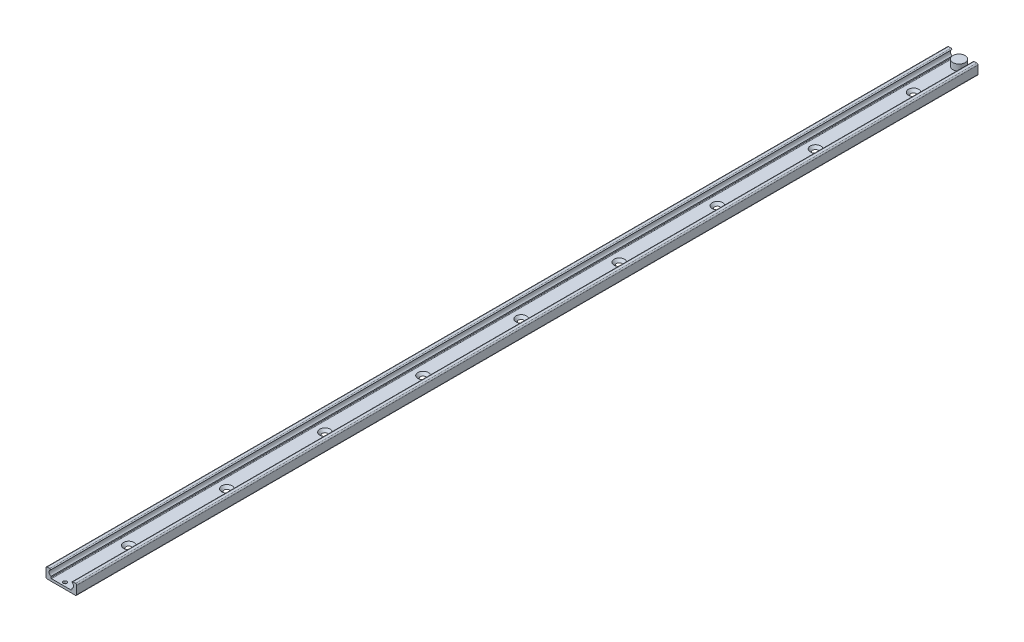
ISO-10303-21;
HEADER;
FILE_DESCRIPTION(('STEP AP214'),'2;1');
FILE_NAME('part.step','',(''),(''),'','','');
FILE_SCHEMA(('AUTOMOTIVE_DESIGN { 1 0 10303 214 1 1 1 1 }'));
ENDSEC;
DATA;
#1=APPLICATION_CONTEXT('core data for automotive mechanical design processes');
#2=APPLICATION_PROTOCOL_DEFINITION('international standard','automotive_design',2000,#1);
#3=PRODUCT_CONTEXT('',#1,'mechanical');
#4=PRODUCT('Part','Part','',(#3));
#5=PRODUCT_RELATED_PRODUCT_CATEGORY('part','',(#4));
#6=PRODUCT_DEFINITION_FORMATION('','',#4);
#7=PRODUCT_DEFINITION_CONTEXT('part definition',#1,'design');
#8=PRODUCT_DEFINITION('design','',#6,#7);
#9=PRODUCT_DEFINITION_SHAPE('','',#8);
#10=(LENGTH_UNIT() NAMED_UNIT(*) SI_UNIT(.MILLI.,.METRE.));
#11=(NAMED_UNIT(*) PLANE_ANGLE_UNIT() SI_UNIT($,.RADIAN.));
#12=(NAMED_UNIT(*) SI_UNIT($,.STERADIAN.) SOLID_ANGLE_UNIT());
#13=UNCERTAINTY_MEASURE_WITH_UNIT(LENGTH_MEASURE(1.E-05),#10,'distance_accuracy_value','');
#14=(GEOMETRIC_REPRESENTATION_CONTEXT(3) GLOBAL_UNCERTAINTY_ASSIGNED_CONTEXT((#13)) GLOBAL_UNIT_ASSIGNED_CONTEXT((#10,
#11,#12)) REPRESENTATION_CONTEXT('',''));
#15=CARTESIAN_POINT('',(0.,0.,0.));
#16=DIRECTION('',(0.,0.,1.));
#17=DIRECTION('',(1.,0.,0.));
#18=AXIS2_PLACEMENT_3D('',#15,#16,#17);
#19=CARTESIAN_POINT('',(9.5,7.5,0.));
#20=DIRECTION('',(0.,0.,1.));
#21=DIRECTION('',(1.,0.,0.));
#22=AXIS2_PLACEMENT_3D('',#19,#20,#21);
#23=CYLINDRICAL_SURFACE('',#22,1.);
#24=DIRECTION('',(0.,0.,1.));
#25=VECTOR('',#24,1.);
#26=CARTESIAN_POINT('',(8.60359240331616,7.94323066298205,0.));
#27=LINE('',#26,#25);
#28=CARTESIAN_POINT('',(8.60359240331616,7.94323066298205,0.));
#29=VERTEX_POINT('',#28);
#30=CARTESIAN_POINT('',(8.60359240331616,7.94323066298205,735.));
#31=VERTEX_POINT('',#30);
#32=EDGE_CURVE('E398',#29,#31,#27,.T.);
#33=ORIENTED_EDGE('',*,*,#32,.T.);
#34=CARTESIAN_POINT('',(9.5,7.5,735.));
#35=DIRECTION('',(0.,0.,1.));
#36=DIRECTION('',(1.,0.,0.));
#37=AXIS2_PLACEMENT_3D('',#34,#35,#36);
#38=CIRCLE('',#37,1.);
#39=CARTESIAN_POINT('',(9.5,8.5,735.));
#40=VERTEX_POINT('',#39);
#41=EDGE_CURVE('E228',#40,#31,#38,.T.);
#42=ORIENTED_EDGE('',*,*,#41,.F.);
#43=DIRECTION('',(0.,0.,1.));
#44=VECTOR('',#43,1.);
#45=CARTESIAN_POINT('',(9.5,8.5,0.));
#46=LINE('',#45,#44);
#47=CARTESIAN_POINT('',(9.5,8.5,0.));
#48=VERTEX_POINT('',#47);
#49=EDGE_CURVE('E399',#48,#40,#46,.T.);
#50=ORIENTED_EDGE('',*,*,#49,.F.);
#51=CARTESIAN_POINT('',(9.5,7.5,0.));
#52=DIRECTION('',(0.,0.,1.));
#53=DIRECTION('',(1.,0.,0.));
#54=AXIS2_PLACEMENT_3D('',#51,#52,#53);
#55=CIRCLE('',#54,1.);
#56=EDGE_CURVE('E350',#48,#29,#55,.T.);
#57=ORIENTED_EDGE('',*,*,#56,.T.);
#58=EDGE_LOOP('',(#33,#42,#50,#57));
#59=FACE_BOUND('',#58,.T.);
#60=ADVANCED_FACE('F45',(#59),#23,.T.);
#61=CARTESIAN_POINT('',(12.5,8.5,0.));
#62=DIRECTION('',(0.,1.,0.));
#63=DIRECTION('',(0.,0.,1.));
#64=AXIS2_PLACEMENT_3D('',#61,#62,#63);
#65=PLANE('',#64);
#66=ORIENTED_EDGE('',*,*,#49,.T.);
#67=DIRECTION('',(-1.,0.,0.));
#68=VECTOR('',#67,1.);
#69=CARTESIAN_POINT('',(0.,8.5,735.));
#70=LINE('',#69,#68);
#71=CARTESIAN_POINT('',(11.5000000000008,8.5,735.));
#72=VERTEX_POINT('',#71);
#73=EDGE_CURVE('E224',#72,#40,#70,.T.);
#74=ORIENTED_EDGE('',*,*,#73,.F.);
#75=DIRECTION('',(0.,0.,1.));
#76=VECTOR('',#75,1.);
#77=CARTESIAN_POINT('',(11.5000000000008,8.5,0.));
#78=LINE('',#77,#76);
#79=CARTESIAN_POINT('',(11.5000000000008,8.5,0.));
#80=VERTEX_POINT('',#79);
#81=EDGE_CURVE('E451',#72,#80,#78,.F.);
#82=ORIENTED_EDGE('',*,*,#81,.T.);
#83=DIRECTION('',(-1.,0.,0.));
#84=VECTOR('',#83,1.);
#85=CARTESIAN_POINT('',(12.5,8.5,0.));
#86=LINE('',#85,#84);
#87=EDGE_CURVE('E395',#80,#48,#86,.T.);
#88=ORIENTED_EDGE('',*,*,#87,.T.);
#89=EDGE_LOOP('',(#66,#74,#82,#88));
#90=FACE_BOUND('',#89,.T.);
#91=ADVANCED_FACE('F632',(#90),#65,.T.);
#92=CARTESIAN_POINT('',(12.5,0.,0.));
#93=DIRECTION('',(1.,0.,0.));
#94=DIRECTION('',(0.,0.,-1.));
#95=AXIS2_PLACEMENT_3D('',#92,#93,#94);
#96=PLANE('',#95);
#97=DIRECTION('',(0.,0.,1.));
#98=VECTOR('',#97,1.);
#99=CARTESIAN_POINT('',(12.5,7.50000000000078,0.));
#100=LINE('',#99,#98);
#101=CARTESIAN_POINT('',(12.5,7.50000000000078,0.));
#102=VERTEX_POINT('',#101);
#103=CARTESIAN_POINT('',(12.5,7.50000000000078,735.));
#104=VERTEX_POINT('',#103);
#105=EDGE_CURVE('E435',#102,#104,#100,.T.);
#106=ORIENTED_EDGE('',*,*,#105,.T.);
#107=DIRECTION('',(0.,1.,0.));
#108=VECTOR('',#107,1.);
#109=CARTESIAN_POINT('',(12.5,0.,735.));
#110=LINE('',#109,#108);
#111=CARTESIAN_POINT('',(12.5,0.999999999999222,735.));
#112=VERTEX_POINT('',#111);
#113=EDGE_CURVE('E216',#112,#104,#110,.T.);
#114=ORIENTED_EDGE('',*,*,#113,.F.);
#115=DIRECTION('',(0.,0.,1.));
#116=VECTOR('',#115,1.);
#117=CARTESIAN_POINT('',(12.5,0.999999999999222,0.));
#118=LINE('',#117,#116);
#119=CARTESIAN_POINT('',(12.5,0.999999999999222,0.));
#120=VERTEX_POINT('',#119);
#121=EDGE_CURVE('E438',#112,#120,#118,.F.);
#122=ORIENTED_EDGE('',*,*,#121,.T.);
#123=DIRECTION('',(0.,1.,0.));
#124=VECTOR('',#123,1.);
#125=CARTESIAN_POINT('',(12.5,0.,0.));
#126=LINE('',#125,#124);
#127=EDGE_CURVE('E391',#120,#102,#126,.T.);
#128=ORIENTED_EDGE('',*,*,#127,.T.);
#129=EDGE_LOOP('',(#106,#114,#122,#128));
#130=FACE_BOUND('',#129,.T.);
#131=ADVANCED_FACE('F638',(#130),#96,.T.);
#132=CARTESIAN_POINT('',(-12.5,0.,0.));
#133=DIRECTION('',(0.,-1.,0.));
#134=DIRECTION('',(0.,0.,-1.));
#135=AXIS2_PLACEMENT_3D('',#132,#133,#134);
#136=PLANE('',#135);
#137=CARTESIAN_POINT('',(0.,0.,732.));
#138=DIRECTION('',(0.,1.,0.));
#139=DIRECTION('',(0.,0.,1.));
#140=AXIS2_PLACEMENT_3D('',#137,#138,#139);
#141=CIRCLE('',#140,1.5);
#142=CARTESIAN_POINT('',(0.,0.,733.5));
#143=VERTEX_POINT('',#142);
#144=EDGE_CURVE('E204',#143,#143,#141,.T.);
#145=ORIENTED_EDGE('',*,*,#144,.T.);
#146=EDGE_LOOP('',(#145));
#147=FACE_BOUND('',#146,.T.);
#148=CARTESIAN_POINT('',(0.,0.,40.));
#149=DIRECTION('',(0.,1.,0.));
#150=DIRECTION('',(0.,0.,1.));
#151=AXIS2_PLACEMENT_3D('',#148,#149,#150);
#152=CIRCLE('',#151,2.25000000000002);
#153=CARTESIAN_POINT('',(0.,0.,42.25));
#154=VERTEX_POINT('',#153);
#155=EDGE_CURVE('E277',#154,#154,#152,.T.);
#156=ORIENTED_EDGE('',*,*,#155,.T.);
#157=EDGE_LOOP('',(#156));
#158=FACE_BOUND('',#157,.T.);
#159=CARTESIAN_POINT('',(0.,0.,680.));
#160=DIRECTION('',(0.,1.,0.));
#161=DIRECTION('',(0.,0.,1.));
#162=AXIS2_PLACEMENT_3D('',#159,#160,#161);
#163=CIRCLE('',#162,2.25000000000002);
#164=CARTESIAN_POINT('',(0.,0.,682.25));
#165=VERTEX_POINT('',#164);
#166=EDGE_CURVE('E285',#165,#165,#163,.T.);
#167=ORIENTED_EDGE('',*,*,#166,.T.);
#168=EDGE_LOOP('',(#167));
#169=FACE_BOUND('',#168,.T.);
#170=CARTESIAN_POINT('',(0.,0.,600.));
#171=DIRECTION('',(0.,1.,0.));
#172=DIRECTION('',(0.,0.,1.));
#173=AXIS2_PLACEMENT_3D('',#170,#171,#172);
#174=CIRCLE('',#173,2.25000000000002);
#175=CARTESIAN_POINT('',(0.,0.,602.25));
#176=VERTEX_POINT('',#175);
#177=EDGE_CURVE('E293',#176,#176,#174,.T.);
#178=ORIENTED_EDGE('',*,*,#177,.T.);
#179=EDGE_LOOP('',(#178));
#180=FACE_BOUND('',#179,.T.);
#181=CARTESIAN_POINT('',(0.,0.,520.));
#182=DIRECTION('',(0.,1.,0.));
#183=DIRECTION('',(0.,0.,1.));
#184=AXIS2_PLACEMENT_3D('',#181,#182,#183);
#185=CIRCLE('',#184,2.25000000000002);
#186=CARTESIAN_POINT('',(0.,0.,522.25));
#187=VERTEX_POINT('',#186);
#188=EDGE_CURVE('E301',#187,#187,#185,.T.);
#189=ORIENTED_EDGE('',*,*,#188,.T.);
#190=EDGE_LOOP('',(#189));
#191=FACE_BOUND('',#190,.T.);
#192=CARTESIAN_POINT('',(0.,0.,440.));
#193=DIRECTION('',(0.,1.,0.));
#194=DIRECTION('',(0.,0.,1.));
#195=AXIS2_PLACEMENT_3D('',#192,#193,#194);
#196=CIRCLE('',#195,2.25000000000002);
#197=CARTESIAN_POINT('',(0.,0.,442.25));
#198=VERTEX_POINT('',#197);
#199=EDGE_CURVE('E309',#198,#198,#196,.T.);
#200=ORIENTED_EDGE('',*,*,#199,.T.);
#201=EDGE_LOOP('',(#200));
#202=FACE_BOUND('',#201,.T.);
#203=CARTESIAN_POINT('',(0.,0.,360.));
#204=DIRECTION('',(0.,1.,0.));
#205=DIRECTION('',(0.,0.,1.));
#206=AXIS2_PLACEMENT_3D('',#203,#204,#205);
#207=CIRCLE('',#206,2.25000000000002);
#208=CARTESIAN_POINT('',(0.,0.,362.25));
#209=VERTEX_POINT('',#208);
#210=EDGE_CURVE('E317',#209,#209,#207,.T.);
#211=ORIENTED_EDGE('',*,*,#210,.T.);
#212=EDGE_LOOP('',(#211));
#213=FACE_BOUND('',#212,.T.);
#214=CARTESIAN_POINT('',(0.,0.,280.));
#215=DIRECTION('',(0.,1.,0.));
#216=DIRECTION('',(0.,0.,1.));
#217=AXIS2_PLACEMENT_3D('',#214,#215,#216);
#218=CIRCLE('',#217,2.25000000000002);
#219=CARTESIAN_POINT('',(0.,0.,282.25));
#220=VERTEX_POINT('',#219);
#221=EDGE_CURVE('E325',#220,#220,#218,.T.);
#222=ORIENTED_EDGE('',*,*,#221,.T.);
#223=EDGE_LOOP('',(#222));
#224=FACE_BOUND('',#223,.T.);
#225=CARTESIAN_POINT('',(0.,0.,200.));
#226=DIRECTION('',(0.,1.,0.));
#227=DIRECTION('',(0.,0.,1.));
#228=AXIS2_PLACEMENT_3D('',#225,#226,#227);
#229=CIRCLE('',#228,2.25000000000002);
#230=CARTESIAN_POINT('',(0.,0.,202.25));
#231=VERTEX_POINT('',#230);
#232=EDGE_CURVE('E333',#231,#231,#229,.T.);
#233=ORIENTED_EDGE('',*,*,#232,.T.);
#234=EDGE_LOOP('',(#233));
#235=FACE_BOUND('',#234,.T.);
#236=CARTESIAN_POINT('',(0.,0.,120.));
#237=DIRECTION('',(0.,1.,0.));
#238=DIRECTION('',(0.,0.,1.));
#239=AXIS2_PLACEMENT_3D('',#236,#237,#238);
#240=CIRCLE('',#239,2.25000000000002);
#241=CARTESIAN_POINT('',(0.,0.,122.25));
#242=VERTEX_POINT('',#241);
#243=EDGE_CURVE('E341',#242,#242,#240,.T.);
#244=ORIENTED_EDGE('',*,*,#243,.T.);
#245=EDGE_LOOP('',(#244));
#246=FACE_BOUND('',#245,.T.);
#247=DIRECTION('',(1.,0.,0.));
#248=VECTOR('',#247,1.);
#249=CARTESIAN_POINT('',(-12.5,0.,0.));
#250=LINE('',#249,#248);
#251=CARTESIAN_POINT('',(-11.5000000000008,0.,0.));
#252=VERTEX_POINT('',#251);
#253=CARTESIAN_POINT('',(11.5000000000008,0.,0.));
#254=VERTEX_POINT('',#253);
#255=EDGE_CURVE('E388',#252,#254,#250,.T.);
#256=ORIENTED_EDGE('',*,*,#255,.T.);
#257=DIRECTION('',(0.,0.,1.));
#258=VECTOR('',#257,1.);
#259=CARTESIAN_POINT('',(11.5000000000008,0.,0.));
#260=LINE('',#259,#258);
#261=CARTESIAN_POINT('',(11.5000000000008,0.,735.));
#262=VERTEX_POINT('',#261);
#263=EDGE_CURVE('E185',#254,#262,#260,.T.);
#264=ORIENTED_EDGE('',*,*,#263,.T.);
#265=DIRECTION('',(1.,0.,0.));
#266=VECTOR('',#265,1.);
#267=CARTESIAN_POINT('',(0.,0.,735.));
#268=LINE('',#267,#266);
#269=CARTESIAN_POINT('',(-11.5000000000008,0.,735.));
#270=VERTEX_POINT('',#269);
#271=EDGE_CURVE('E189',#270,#262,#268,.T.);
#272=ORIENTED_EDGE('',*,*,#271,.F.);
#273=DIRECTION('',(0.,0.,1.));
#274=VECTOR('',#273,1.);
#275=CARTESIAN_POINT('',(-11.5000000000008,0.,0.));
#276=LINE('',#275,#274);
#277=EDGE_CURVE('E177',#270,#252,#276,.F.);
#278=ORIENTED_EDGE('',*,*,#277,.T.);
#279=EDGE_LOOP('',(#256,#264,#272,#278));
#280=FACE_BOUND('',#279,.T.);
#281=ADVANCED_FACE('F190',(#147,#158,#169,#180,#191,#202,#213,#224,#235,#246,#280),#136,.T.);
#282=CARTESIAN_POINT('',(-12.5,8.5,0.));
#283=DIRECTION('',(-1.,0.,0.));
#284=DIRECTION('',(0.,0.,1.));
#285=AXIS2_PLACEMENT_3D('',#282,#283,#284);
#286=PLANE('',#285);
#287=DIRECTION('',(0.,0.,1.));
#288=VECTOR('',#287,1.);
#289=CARTESIAN_POINT('',(-12.5,0.999999999999222,0.));
#290=LINE('',#289,#288);
#291=CARTESIAN_POINT('',(-12.5,0.999999999999222,0.));
#292=VERTEX_POINT('',#291);
#293=CARTESIAN_POINT('',(-12.5,0.999999999999222,735.));
#294=VERTEX_POINT('',#293);
#295=EDGE_CURVE('E54',#292,#294,#290,.T.);
#296=ORIENTED_EDGE('',*,*,#295,.T.);
#297=DIRECTION('',(0.,-1.,0.));
#298=VECTOR('',#297,1.);
#299=CARTESIAN_POINT('',(-12.5,0.,735.));
#300=LINE('',#299,#298);
#301=CARTESIAN_POINT('',(-12.5,7.50000000000078,735.));
#302=VERTEX_POINT('',#301);
#303=EDGE_CURVE('E202',#302,#294,#300,.T.);
#304=ORIENTED_EDGE('',*,*,#303,.F.);
#305=DIRECTION('',(0.,0.,1.));
#306=VECTOR('',#305,1.);
#307=CARTESIAN_POINT('',(-12.5,7.50000000000078,0.));
#308=LINE('',#307,#306);
#309=CARTESIAN_POINT('',(-12.5,7.50000000000078,0.));
#310=VERTEX_POINT('',#309);
#311=EDGE_CURVE('E11',#302,#310,#308,.F.);
#312=ORIENTED_EDGE('',*,*,#311,.T.);
#313=DIRECTION('',(0.,-1.,0.));
#314=VECTOR('',#313,1.);
#315=CARTESIAN_POINT('',(-12.5,8.5,0.));
#316=LINE('',#315,#314);
#317=EDGE_CURVE('E385',#310,#292,#316,.T.);
#318=ORIENTED_EDGE('',*,*,#317,.T.);
#319=EDGE_LOOP('',(#296,#304,#312,#318));
#320=FACE_BOUND('',#319,.T.);
#321=ADVANCED_FACE('F460',(#320),#286,.T.);
#322=CARTESIAN_POINT('',(-9.5,8.5,0.));
#323=DIRECTION('',(0.,1.,0.));
#324=DIRECTION('',(0.,0.,1.));
#325=AXIS2_PLACEMENT_3D('',#322,#323,#324);
#326=PLANE('',#325);
#327=DIRECTION('',(-1.,0.,0.));
#328=VECTOR('',#327,1.);
#329=CARTESIAN_POINT('',(-9.5,8.5,0.));
#330=LINE('',#329,#328);
#331=CARTESIAN_POINT('',(-9.5,8.5,0.));
#332=VERTEX_POINT('',#331);
#333=CARTESIAN_POINT('',(-11.5000000000008,8.5,0.));
#334=VERTEX_POINT('',#333);
#335=EDGE_CURVE('E382',#332,#334,#330,.T.);
#336=ORIENTED_EDGE('',*,*,#335,.T.);
#337=DIRECTION('',(0.,0.,1.));
#338=VECTOR('',#337,1.);
#339=CARTESIAN_POINT('',(-11.5000000000008,8.5,0.));
#340=LINE('',#339,#338);
#341=CARTESIAN_POINT('',(-11.5000000000008,8.5,735.));
#342=VERTEX_POINT('',#341);
#343=EDGE_CURVE('E454',#334,#342,#340,.T.);
#344=ORIENTED_EDGE('',*,*,#343,.T.);
#345=DIRECTION('',(-1.,0.,0.));
#346=VECTOR('',#345,1.);
#347=CARTESIAN_POINT('',(0.,8.5,735.));
#348=LINE('',#347,#346);
#349=CARTESIAN_POINT('',(-9.5,8.5,735.));
#350=VERTEX_POINT('',#349);
#351=EDGE_CURVE('E264',#350,#342,#348,.T.);
#352=ORIENTED_EDGE('',*,*,#351,.F.);
#353=DIRECTION('',(0.,0.,1.));
#354=VECTOR('',#353,1.);
#355=CARTESIAN_POINT('',(-9.5,8.5,0.));
#356=LINE('',#355,#354);
#357=EDGE_CURVE('E403',#332,#350,#356,.T.);
#358=ORIENTED_EDGE('',*,*,#357,.F.);
#359=EDGE_LOOP('',(#336,#344,#352,#358));
#360=FACE_BOUND('',#359,.T.);
#361=ADVANCED_FACE('F469',(#360),#326,.T.);
#362=CARTESIAN_POINT('',(-9.5,7.5,0.));
#363=DIRECTION('',(0.,0.,1.));
#364=DIRECTION('',(1.,0.,0.));
#365=AXIS2_PLACEMENT_3D('',#362,#363,#364);
#366=CYLINDRICAL_SURFACE('',#365,1.);
#367=ORIENTED_EDGE('',*,*,#357,.T.);
#368=CARTESIAN_POINT('',(-9.5,7.5,735.));
#369=DIRECTION('',(0.,0.,1.));
#370=DIRECTION('',(1.,0.,0.));
#371=AXIS2_PLACEMENT_3D('',#368,#369,#370);
#372=CIRCLE('',#371,1.);
#373=CARTESIAN_POINT('',(-8.60359240331616,7.94323066298205,735.));
#374=VERTEX_POINT('',#373);
#375=EDGE_CURVE('E260',#374,#350,#372,.T.);
#376=ORIENTED_EDGE('',*,*,#375,.F.);
#377=DIRECTION('',(0.,0.,1.));
#378=VECTOR('',#377,1.);
#379=CARTESIAN_POINT('',(-8.60359240331616,7.94323066298205,0.));
#380=LINE('',#379,#378);
#381=CARTESIAN_POINT('',(-8.60359240331616,7.94323066298205,0.));
#382=VERTEX_POINT('',#381);
#383=EDGE_CURVE('E406',#382,#374,#380,.T.);
#384=ORIENTED_EDGE('',*,*,#383,.F.);
#385=CARTESIAN_POINT('',(-9.5,7.5,0.));
#386=DIRECTION('',(0.,0.,1.));
#387=DIRECTION('',(1.,0.,0.));
#388=AXIS2_PLACEMENT_3D('',#385,#386,#387);
#389=CIRCLE('',#388,1.);
#390=EDGE_CURVE('E378',#382,#332,#389,.T.);
#391=ORIENTED_EDGE('',*,*,#390,.T.);
#392=EDGE_LOOP('',(#367,#376,#384,#391));
#393=FACE_BOUND('',#392,.T.);
#394=ADVANCED_FACE('F473',(#393),#366,.T.);
#395=CARTESIAN_POINT('',(-7.5,5.7,0.));
#396=DIRECTION('',(0.,0.,1.));
#397=DIRECTION('',(1.,0.,0.));
#398=AXIS2_PLACEMENT_3D('',#395,#396,#397);
#399=CYLINDRICAL_SURFACE('',#398,2.5);
#400=ORIENTED_EDGE('',*,*,#383,.T.);
#401=CARTESIAN_POINT('',(-7.5,5.7,735.));
#402=DIRECTION('',(0.,0.,1.));
#403=DIRECTION('',(1.,0.,0.));
#404=AXIS2_PLACEMENT_3D('',#401,#402,#403);
#405=CIRCLE('',#404,2.5);
#406=CARTESIAN_POINT('',(-8.5,3.40871215252208,735.));
#407=VERTEX_POINT('',#406);
#408=EDGE_CURVE('E256',#407,#374,#405,.F.);
#409=ORIENTED_EDGE('',*,*,#408,.F.);
#410=DIRECTION('',(0.,0.,1.));
#411=VECTOR('',#410,1.);
#412=CARTESIAN_POINT('',(-8.5,3.40871215252208,0.));
#413=LINE('',#412,#411);
#414=CARTESIAN_POINT('',(-8.5,3.40871215252208,0.));
#415=VERTEX_POINT('',#414);
#416=EDGE_CURVE('E409',#415,#407,#413,.T.);
#417=ORIENTED_EDGE('',*,*,#416,.F.);
#418=CARTESIAN_POINT('',(-7.5,5.7,0.));
#419=DIRECTION('',(0.,0.,-1.));
#420=DIRECTION('',(-1.,0.,0.));
#421=AXIS2_PLACEMENT_3D('',#418,#419,#420);
#422=CIRCLE('',#421,2.5);
#423=EDGE_CURVE('E374',#415,#382,#422,.T.);
#424=ORIENTED_EDGE('',*,*,#423,.T.);
#425=EDGE_LOOP('',(#400,#409,#417,#424));
#426=FACE_BOUND('',#425,.T.);
#427=ADVANCED_FACE('F479',(#426),#399,.F.);
#428=CARTESIAN_POINT('',(-8.5,2.,0.));
#429=DIRECTION('',(1.,0.,0.));
#430=DIRECTION('',(0.,0.,-1.));
#431=AXIS2_PLACEMENT_3D('',#428,#429,#430);
#432=PLANE('',#431);
#433=ORIENTED_EDGE('',*,*,#416,.T.);
#434=DIRECTION('',(0.,1.,0.));
#435=VECTOR('',#434,1.);
#436=CARTESIAN_POINT('',(-8.5,0.,735.));
#437=LINE('',#436,#435);
#438=CARTESIAN_POINT('',(-8.5,2.49999999999991,735.));
#439=VERTEX_POINT('',#438);
#440=EDGE_CURVE('E252',#439,#407,#437,.T.);
#441=ORIENTED_EDGE('',*,*,#440,.F.);
#442=DIRECTION('',(0.,0.,1.));
#443=VECTOR('',#442,1.);
#444=CARTESIAN_POINT('',(-8.5,2.49999999999991,0.));
#445=LINE('',#444,#443);
#446=CARTESIAN_POINT('',(-8.5,2.49999999999991,0.));
#447=VERTEX_POINT('',#446);
#448=EDGE_CURVE('E422',#439,#447,#445,.F.);
#449=ORIENTED_EDGE('',*,*,#448,.T.);
#450=DIRECTION('',(0.,1.,0.));
#451=VECTOR('',#450,1.);
#452=CARTESIAN_POINT('',(-8.5,2.,0.));
#453=LINE('',#452,#451);
#454=EDGE_CURVE('E370',#447,#415,#453,.T.);
#455=ORIENTED_EDGE('',*,*,#454,.T.);
#456=EDGE_LOOP('',(#433,#441,#449,#455));
#457=FACE_BOUND('',#456,.T.);
#458=ADVANCED_FACE('F482',(#457),#432,.T.);
#459=CARTESIAN_POINT('',(8.5,2.,0.));
#460=DIRECTION('',(0.,1.,0.));
#461=DIRECTION('',(0.,0.,1.));
#462=AXIS2_PLACEMENT_3D('',#459,#460,#461);
#463=PLANE('',#462);
#464=CARTESIAN_POINT('',(0.,2.,732.));
#465=DIRECTION('',(0.,1.,0.));
#466=DIRECTION('',(0.,0.,1.));
#467=AXIS2_PLACEMENT_3D('',#464,#465,#466);
#468=CIRCLE('',#467,1.5);
#469=CARTESIAN_POINT('',(0.,2.,733.5));
#470=VERTEX_POINT('',#469);
#471=EDGE_CURVE('E210',#470,#470,#468,.T.);
#472=ORIENTED_EDGE('',*,*,#471,.F.);
#473=EDGE_LOOP('',(#472));
#474=FACE_BOUND('',#473,.T.);
#475=CARTESIAN_POINT('',(0.,2.,40.));
#476=DIRECTION('',(0.,1.,0.));
#477=DIRECTION('',(0.,0.,1.));
#478=AXIS2_PLACEMENT_3D('',#475,#476,#477);
#479=CIRCLE('',#478,4.25000000000001);
#480=CARTESIAN_POINT('',(0.,2.,44.25));
#481=VERTEX_POINT('',#480);
#482=EDGE_CURVE('E273',#481,#481,#479,.T.);
#483=ORIENTED_EDGE('',*,*,#482,.F.);
#484=EDGE_LOOP('',(#483));
#485=FACE_BOUND('',#484,.T.);
#486=CARTESIAN_POINT('',(0.,2.,680.));
#487=DIRECTION('',(0.,1.,0.));
#488=DIRECTION('',(0.,0.,1.));
#489=AXIS2_PLACEMENT_3D('',#486,#487,#488);
#490=CIRCLE('',#489,4.25000000000001);
#491=CARTESIAN_POINT('',(0.,2.,684.25));
#492=VERTEX_POINT('',#491);
#493=EDGE_CURVE('E281',#492,#492,#490,.T.);
#494=ORIENTED_EDGE('',*,*,#493,.F.);
#495=EDGE_LOOP('',(#494));
#496=FACE_BOUND('',#495,.T.);
#497=CARTESIAN_POINT('',(0.,2.,600.));
#498=DIRECTION('',(0.,1.,0.));
#499=DIRECTION('',(0.,0.,1.));
#500=AXIS2_PLACEMENT_3D('',#497,#498,#499);
#501=CIRCLE('',#500,4.25000000000001);
#502=CARTESIAN_POINT('',(0.,2.,604.25));
#503=VERTEX_POINT('',#502);
#504=EDGE_CURVE('E289',#503,#503,#501,.T.);
#505=ORIENTED_EDGE('',*,*,#504,.F.);
#506=EDGE_LOOP('',(#505));
#507=FACE_BOUND('',#506,.T.);
#508=CARTESIAN_POINT('',(0.,2.,520.));
#509=DIRECTION('',(0.,1.,0.));
#510=DIRECTION('',(0.,0.,1.));
#511=AXIS2_PLACEMENT_3D('',#508,#509,#510);
#512=CIRCLE('',#511,4.25000000000001);
#513=CARTESIAN_POINT('',(0.,2.,524.25));
#514=VERTEX_POINT('',#513);
#515=EDGE_CURVE('E297',#514,#514,#512,.T.);
#516=ORIENTED_EDGE('',*,*,#515,.F.);
#517=EDGE_LOOP('',(#516));
#518=FACE_BOUND('',#517,.T.);
#519=CARTESIAN_POINT('',(0.,2.,440.));
#520=DIRECTION('',(0.,1.,0.));
#521=DIRECTION('',(0.,0.,1.));
#522=AXIS2_PLACEMENT_3D('',#519,#520,#521);
#523=CIRCLE('',#522,4.25000000000001);
#524=CARTESIAN_POINT('',(0.,2.,444.25));
#525=VERTEX_POINT('',#524);
#526=EDGE_CURVE('E305',#525,#525,#523,.T.);
#527=ORIENTED_EDGE('',*,*,#526,.F.);
#528=EDGE_LOOP('',(#527));
#529=FACE_BOUND('',#528,.T.);
#530=CARTESIAN_POINT('',(0.,2.,360.));
#531=DIRECTION('',(0.,1.,0.));
#532=DIRECTION('',(0.,0.,1.));
#533=AXIS2_PLACEMENT_3D('',#530,#531,#532);
#534=CIRCLE('',#533,4.25000000000001);
#535=CARTESIAN_POINT('',(0.,2.,364.25));
#536=VERTEX_POINT('',#535);
#537=EDGE_CURVE('E313',#536,#536,#534,.T.);
#538=ORIENTED_EDGE('',*,*,#537,.F.);
#539=EDGE_LOOP('',(#538));
#540=FACE_BOUND('',#539,.T.);
#541=CARTESIAN_POINT('',(0.,2.,280.));
#542=DIRECTION('',(0.,1.,0.));
#543=DIRECTION('',(0.,0.,1.));
#544=AXIS2_PLACEMENT_3D('',#541,#542,#543);
#545=CIRCLE('',#544,4.25000000000001);
#546=CARTESIAN_POINT('',(0.,2.,284.25));
#547=VERTEX_POINT('',#546);
#548=EDGE_CURVE('E321',#547,#547,#545,.T.);
#549=ORIENTED_EDGE('',*,*,#548,.F.);
#550=EDGE_LOOP('',(#549));
#551=FACE_BOUND('',#550,.T.);
#552=CARTESIAN_POINT('',(0.,2.,200.));
#553=DIRECTION('',(0.,1.,0.));
#554=DIRECTION('',(0.,0.,1.));
#555=AXIS2_PLACEMENT_3D('',#552,#553,#554);
#556=CIRCLE('',#555,4.25000000000001);
#557=CARTESIAN_POINT('',(0.,2.,204.25));
#558=VERTEX_POINT('',#557);
#559=EDGE_CURVE('E329',#558,#558,#556,.T.);
#560=ORIENTED_EDGE('',*,*,#559,.F.);
#561=EDGE_LOOP('',(#560));
#562=FACE_BOUND('',#561,.T.);
#563=CARTESIAN_POINT('',(0.,2.,120.));
#564=DIRECTION('',(0.,1.,0.));
#565=DIRECTION('',(0.,0.,1.));
#566=AXIS2_PLACEMENT_3D('',#563,#564,#565);
#567=CIRCLE('',#566,4.25000000000001);
#568=CARTESIAN_POINT('',(0.,2.,124.25));
#569=VERTEX_POINT('',#568);
#570=EDGE_CURVE('E337',#569,#569,#567,.T.);
#571=ORIENTED_EDGE('',*,*,#570,.F.);
#572=EDGE_LOOP('',(#571));
#573=FACE_BOUND('',#572,.T.);
#574=DIRECTION('',(-1.,0.,0.));
#575=VECTOR('',#574,1.);
#576=CARTESIAN_POINT('',(8.5,2.,0.));
#577=LINE('',#576,#575);
#578=CARTESIAN_POINT('',(-4.,2.,0.));
#579=VERTEX_POINT('',#578);
#580=CARTESIAN_POINT('',(-8.00000000000009,2.,0.));
#581=VERTEX_POINT('',#580);
#582=EDGE_CURVE('E366',#579,#581,#577,.T.);
#583=ORIENTED_EDGE('',*,*,#582,.T.);
#584=DIRECTION('',(0.,0.,1.));
#585=VECTOR('',#584,1.);
#586=CARTESIAN_POINT('',(-8.00000000000009,2.,720.));
#587=LINE('',#586,#585);
#588=CARTESIAN_POINT('',(-8.00000000000009,2.,735.));
#589=VERTEX_POINT('',#588);
#590=EDGE_CURVE('E419',#581,#589,#587,.T.);
#591=ORIENTED_EDGE('',*,*,#590,.T.);
#592=DIRECTION('',(-1.,0.,0.));
#593=VECTOR('',#592,1.);
#594=CARTESIAN_POINT('',(0.,2.,735.));
#595=LINE('',#594,#593);
#596=CARTESIAN_POINT('',(8.00000000000009,2.,735.));
#597=VERTEX_POINT('',#596);
#598=EDGE_CURVE('E244',#597,#589,#595,.T.);
#599=ORIENTED_EDGE('',*,*,#598,.F.);
#600=DIRECTION('',(0.,0.,1.));
#601=VECTOR('',#600,1.);
#602=CARTESIAN_POINT('',(8.00000000000009,2.,0.));
#603=LINE('',#602,#601);
#604=CARTESIAN_POINT('',(8.00000000000009,2.,0.));
#605=VERTEX_POINT('',#604);
#606=EDGE_CURVE('E402',#597,#605,#603,.F.);
#607=ORIENTED_EDGE('',*,*,#606,.T.);
#608=CARTESIAN_POINT('',(4.,2.,0.));
#609=VERTEX_POINT('',#608);
#610=EDGE_CURVE('E367',#605,#609,#577,.T.);
#611=ORIENTED_EDGE('',*,*,#610,.T.);
#612=CARTESIAN_POINT('',(0.,2.,3.));
#613=DIRECTION('',(0.,1.,0.));
#614=DIRECTION('',(0.,0.,1.));
#615=AXIS2_PLACEMENT_3D('',#612,#613,#614);
#616=CIRCLE('',#615,5.);
#617=EDGE_CURVE('E345',#579,#609,#616,.T.);
#618=ORIENTED_EDGE('',*,*,#617,.F.);
#619=EDGE_LOOP('',(#583,#591,#599,#607,#611,#618));
#620=FACE_BOUND('',#619,.T.);
#621=ADVANCED_FACE('F493',(#474,#485,#496,#507,#518,#529,#540,#551,#562,#573,#620),#463,.T.);
#622=CARTESIAN_POINT('',(8.5,3.40871215252208,0.));
#623=DIRECTION('',(-1.,0.,0.));
#624=DIRECTION('',(0.,0.,1.));
#625=AXIS2_PLACEMENT_3D('',#622,#623,#624);
#626=PLANE('',#625);
#627=DIRECTION('',(0.,-1.,0.));
#628=VECTOR('',#627,1.);
#629=CARTESIAN_POINT('',(8.5,3.40871215252208,0.));
#630=LINE('',#629,#628);
#631=CARTESIAN_POINT('',(8.5,3.40871215252208,0.));
#632=VERTEX_POINT('',#631);
#633=CARTESIAN_POINT('',(8.5,2.49999999999991,0.));
#634=VERTEX_POINT('',#633);
#635=EDGE_CURVE('E362',#632,#634,#630,.T.);
#636=ORIENTED_EDGE('',*,*,#635,.T.);
#637=DIRECTION('',(0.,0.,1.));
#638=VECTOR('',#637,1.);
#639=CARTESIAN_POINT('',(8.5,2.49999999999991,720.));
#640=LINE('',#639,#638);
#641=CARTESIAN_POINT('',(8.5,2.49999999999991,735.));
#642=VERTEX_POINT('',#641);
#643=EDGE_CURVE('E425',#634,#642,#640,.T.);
#644=ORIENTED_EDGE('',*,*,#643,.T.);
#645=DIRECTION('',(0.,-1.,0.));
#646=VECTOR('',#645,1.);
#647=CARTESIAN_POINT('',(8.5,0.,735.));
#648=LINE('',#647,#646);
#649=CARTESIAN_POINT('',(8.5,3.40871215252208,735.));
#650=VERTEX_POINT('',#649);
#651=EDGE_CURVE('E236',#650,#642,#648,.T.);
#652=ORIENTED_EDGE('',*,*,#651,.F.);
#653=DIRECTION('',(0.,0.,1.));
#654=VECTOR('',#653,1.);
#655=CARTESIAN_POINT('',(8.5,3.40871215252208,0.));
#656=LINE('',#655,#654);
#657=EDGE_CURVE('E412',#632,#650,#656,.T.);
#658=ORIENTED_EDGE('',*,*,#657,.F.);
#659=EDGE_LOOP('',(#636,#644,#652,#658));
#660=FACE_BOUND('',#659,.T.);
#661=ADVANCED_FACE('F595',(#660),#626,.T.);
#662=CARTESIAN_POINT('',(7.5,5.7,0.));
#663=DIRECTION('',(0.,0.,1.));
#664=DIRECTION('',(1.,0.,0.));
#665=AXIS2_PLACEMENT_3D('',#662,#663,#664);
#666=CYLINDRICAL_SURFACE('',#665,2.5);
#667=ORIENTED_EDGE('',*,*,#657,.T.);
#668=CARTESIAN_POINT('',(7.5,5.7,735.));
#669=DIRECTION('',(0.,0.,1.));
#670=DIRECTION('',(1.,0.,0.));
#671=AXIS2_PLACEMENT_3D('',#668,#669,#670);
#672=CIRCLE('',#671,2.5);
#673=EDGE_CURVE('E232',#31,#650,#672,.F.);
#674=ORIENTED_EDGE('',*,*,#673,.F.);
#675=ORIENTED_EDGE('',*,*,#32,.F.);
#676=CARTESIAN_POINT('',(7.5,5.7,0.));
#677=DIRECTION('',(0.,0.,-1.));
#678=DIRECTION('',(-1.,0.,0.));
#679=AXIS2_PLACEMENT_3D('',#676,#677,#678);
#680=CIRCLE('',#679,2.5);
#681=EDGE_CURVE('E358',#29,#632,#680,.T.);
#682=ORIENTED_EDGE('',*,*,#681,.T.);
#683=EDGE_LOOP('',(#667,#674,#675,#682));
#684=FACE_BOUND('',#683,.T.);
#685=ADVANCED_FACE('F643',(#684),#666,.F.);
#686=CARTESIAN_POINT('',(9.5,7.5,0.));
#687=DIRECTION('',(0.,0.,1.));
#688=DIRECTION('',(1.,0.,0.));
#689=AXIS2_PLACEMENT_3D('',#686,#687,#688);
#690=PLANE('',#689);
#691=ORIENTED_EDGE('',*,*,#127,.F.);
#692=CARTESIAN_POINT('',(11.5000000000008,0.999999999999222,0.));
#693=DIRECTION('',(0.,0.,1.));
#694=DIRECTION('',(1.,0.,0.));
#695=AXIS2_PLACEMENT_3D('',#692,#693,#694);
#696=CIRCLE('',#695,0.999999999999222);
#697=EDGE_CURVE('E448',#120,#254,#696,.F.);
#698=ORIENTED_EDGE('',*,*,#697,.T.);
#699=ORIENTED_EDGE('',*,*,#255,.F.);
#700=CARTESIAN_POINT('',(-11.5000000000008,0.999999999999222,0.));
#701=DIRECTION('',(0.,0.,1.));
#702=DIRECTION('',(1.,0.,0.));
#703=AXIS2_PLACEMENT_3D('',#700,#701,#702);
#704=CIRCLE('',#703,0.999999999999222);
#705=EDGE_CURVE('E67',#252,#292,#704,.F.);
#706=ORIENTED_EDGE('',*,*,#705,.T.);
#707=ORIENTED_EDGE('',*,*,#317,.F.);
#708=CARTESIAN_POINT('',(-11.5000000000008,7.50000000000078,0.));
#709=DIRECTION('',(0.,0.,1.));
#710=DIRECTION('',(1.,0.,0.));
#711=AXIS2_PLACEMENT_3D('',#708,#709,#710);
#712=CIRCLE('',#711,0.999999999999222);
#713=EDGE_CURVE('E61',#310,#334,#712,.F.);
#714=ORIENTED_EDGE('',*,*,#713,.T.);
#715=ORIENTED_EDGE('',*,*,#335,.F.);
#716=ORIENTED_EDGE('',*,*,#390,.F.);
#717=ORIENTED_EDGE('',*,*,#423,.F.);
#718=ORIENTED_EDGE('',*,*,#454,.F.);
#719=CARTESIAN_POINT('',(-8.00000000000009,2.49999999999991,0.));
#720=DIRECTION('',(0.,0.,1.));
#721=DIRECTION('',(1.,0.,0.));
#722=AXIS2_PLACEMENT_3D('',#719,#720,#721);
#723=CIRCLE('',#722,0.49999999999991);
#724=EDGE_CURVE('E428',#447,#581,#723,.T.);
#725=ORIENTED_EDGE('',*,*,#724,.T.);
#726=ORIENTED_EDGE('',*,*,#582,.F.);
#727=EDGE_CURVE('E371',#609,#579,#577,.T.);
#728=ORIENTED_EDGE('',*,*,#727,.F.);
#729=ORIENTED_EDGE('',*,*,#610,.F.);
#730=CARTESIAN_POINT('',(8.00000000000009,2.49999999999991,0.));
#731=DIRECTION('',(0.,0.,1.));
#732=DIRECTION('',(1.,0.,0.));
#733=AXIS2_PLACEMENT_3D('',#730,#731,#732);
#734=CIRCLE('',#733,0.49999999999991);
#735=EDGE_CURVE('E186',#605,#634,#734,.T.);
#736=ORIENTED_EDGE('',*,*,#735,.T.);
#737=ORIENTED_EDGE('',*,*,#635,.F.);
#738=ORIENTED_EDGE('',*,*,#681,.F.);
#739=ORIENTED_EDGE('',*,*,#56,.F.);
#740=ORIENTED_EDGE('',*,*,#87,.F.);
#741=CARTESIAN_POINT('',(11.5000000000008,7.50000000000078,0.));
#742=DIRECTION('',(0.,0.,1.));
#743=DIRECTION('',(1.,0.,0.));
#744=AXIS2_PLACEMENT_3D('',#741,#742,#743);
#745=CIRCLE('',#744,0.999999999999222);
#746=EDGE_CURVE('E445',#80,#102,#745,.F.);
#747=ORIENTED_EDGE('',*,*,#746,.T.);
#748=EDGE_LOOP('',(#691,#698,#699,#706,#707,#714,#715,#716,#717,#718,#725,#726,#728,#729,#736,
#737,#738,#739,#740,#747));
#749=FACE_BOUND('',#748,.T.);
#750=ADVANCED_FACE('F462',(#749),#690,.F.);
#751=CARTESIAN_POINT('',(0.,2.,3.));
#752=DIRECTION('',(0.,1.,0.));
#753=DIRECTION('',(0.,0.,1.));
#754=AXIS2_PLACEMENT_3D('',#751,#752,#753);
#755=PLANE('',#754);
#756=EDGE_CURVE('E351',#609,#579,#616,.T.);
#757=ORIENTED_EDGE('',*,*,#756,.F.);
#758=ORIENTED_EDGE('',*,*,#727,.T.);
#759=EDGE_LOOP('',(#757,#758));
#760=FACE_BOUND('',#759,.T.);
#761=ADVANCED_FACE('F504',(#760),#755,.F.);
#762=CARTESIAN_POINT('',(0.,7.,3.));
#763=DIRECTION('',(0.,-1.,0.));
#764=DIRECTION('',(0.,0.,-1.));
#765=AXIS2_PLACEMENT_3D('',#762,#763,#764);
#766=CYLINDRICAL_SURFACE('',#765,5.);
#767=CARTESIAN_POINT('',(0.,7.,3.));
#768=DIRECTION('',(0.,1.,0.));
#769=DIRECTION('',(0.,0.,1.));
#770=AXIS2_PLACEMENT_3D('',#767,#768,#769);
#771=CIRCLE('',#770,5.);
#772=CARTESIAN_POINT('',(0.,7.,8.));
#773=VERTEX_POINT('',#772);
#774=EDGE_CURVE('E346',#773,#773,#771,.T.);
#775=ORIENTED_EDGE('',*,*,#774,.F.);
#776=EDGE_LOOP('',(#775));
#777=FACE_BOUND('',#776,.T.);
#778=ORIENTED_EDGE('',*,*,#756,.T.);
#779=ORIENTED_EDGE('',*,*,#617,.T.);
#780=EDGE_LOOP('',(#778,#779));
#781=FACE_BOUND('',#780,.T.);
#782=ADVANCED_FACE('F507',(#777,#781),#766,.T.);
#783=CARTESIAN_POINT('',(0.,7.,3.));
#784=DIRECTION('',(0.,1.,0.));
#785=DIRECTION('',(0.,0.,1.));
#786=AXIS2_PLACEMENT_3D('',#783,#784,#785);
#787=PLANE('',#786);
#788=ORIENTED_EDGE('',*,*,#774,.T.);
#789=EDGE_LOOP('',(#788));
#790=FACE_BOUND('',#789,.T.);
#791=ADVANCED_FACE('F618',(#790),#787,.T.);
#792=CARTESIAN_POINT('',(0.,2.,120.));
#793=DIRECTION('',(0.,1.,0.));
#794=DIRECTION('',(0.,0.,1.));
#795=AXIS2_PLACEMENT_3D('',#792,#793,#794);
#796=CONICAL_SURFACE('',#795,4.25000000000001,0.785398163397447);
#797=ORIENTED_EDGE('',*,*,#243,.F.);
#798=EDGE_LOOP('',(#797));
#799=FACE_BOUND('',#798,.T.);
#800=ORIENTED_EDGE('',*,*,#570,.T.);
#801=EDGE_LOOP('',(#800));
#802=FACE_BOUND('',#801,.T.);
#803=ADVANCED_FACE('F615',(#799,#802),#796,.F.);
#804=CARTESIAN_POINT('',(0.,2.,200.));
#805=DIRECTION('',(0.,1.,0.));
#806=DIRECTION('',(0.,0.,1.));
#807=AXIS2_PLACEMENT_3D('',#804,#805,#806);
#808=CONICAL_SURFACE('',#807,4.25000000000001,0.785398163397447);
#809=ORIENTED_EDGE('',*,*,#232,.F.);
#810=EDGE_LOOP('',(#809));
#811=FACE_BOUND('',#810,.T.);
#812=ORIENTED_EDGE('',*,*,#559,.T.);
#813=EDGE_LOOP('',(#812));
#814=FACE_BOUND('',#813,.T.);
#815=ADVANCED_FACE('F617',(#811,#814),#808,.F.);
#816=CARTESIAN_POINT('',(0.,2.,280.));
#817=DIRECTION('',(0.,1.,0.));
#818=DIRECTION('',(0.,0.,1.));
#819=AXIS2_PLACEMENT_3D('',#816,#817,#818);
#820=CONICAL_SURFACE('',#819,4.25000000000001,0.785398163397447);
#821=ORIENTED_EDGE('',*,*,#221,.F.);
#822=EDGE_LOOP('',(#821));
#823=FACE_BOUND('',#822,.T.);
#824=ORIENTED_EDGE('',*,*,#548,.T.);
#825=EDGE_LOOP('',(#824));
#826=FACE_BOUND('',#825,.T.);
#827=ADVANCED_FACE('F625',(#823,#826),#820,.F.);
#828=CARTESIAN_POINT('',(0.,2.,360.));
#829=DIRECTION('',(0.,1.,0.));
#830=DIRECTION('',(0.,0.,1.));
#831=AXIS2_PLACEMENT_3D('',#828,#829,#830);
#832=CONICAL_SURFACE('',#831,4.25000000000001,0.785398163397447);
#833=ORIENTED_EDGE('',*,*,#210,.F.);
#834=EDGE_LOOP('',(#833));
#835=FACE_BOUND('',#834,.T.);
#836=ORIENTED_EDGE('',*,*,#537,.T.);
#837=EDGE_LOOP('',(#836));
#838=FACE_BOUND('',#837,.T.);
#839=ADVANCED_FACE('F691',(#835,#838),#832,.F.);
#840=CARTESIAN_POINT('',(0.,2.,440.));
#841=DIRECTION('',(0.,1.,0.));
#842=DIRECTION('',(0.,0.,1.));
#843=AXIS2_PLACEMENT_3D('',#840,#841,#842);
#844=CONICAL_SURFACE('',#843,4.25000000000001,0.785398163397447);
#845=ORIENTED_EDGE('',*,*,#199,.F.);
#846=EDGE_LOOP('',(#845));
#847=FACE_BOUND('',#846,.T.);
#848=ORIENTED_EDGE('',*,*,#526,.T.);
#849=EDGE_LOOP('',(#848));
#850=FACE_BOUND('',#849,.T.);
#851=ADVANCED_FACE('F687',(#847,#850),#844,.F.);
#852=CARTESIAN_POINT('',(0.,2.,520.));
#853=DIRECTION('',(0.,1.,0.));
#854=DIRECTION('',(0.,0.,1.));
#855=AXIS2_PLACEMENT_3D('',#852,#853,#854);
#856=CONICAL_SURFACE('',#855,4.25000000000001,0.785398163397447);
#857=ORIENTED_EDGE('',*,*,#188,.F.);
#858=EDGE_LOOP('',(#857));
#859=FACE_BOUND('',#858,.T.);
#860=ORIENTED_EDGE('',*,*,#515,.T.);
#861=EDGE_LOOP('',(#860));
#862=FACE_BOUND('',#861,.T.);
#863=ADVANCED_FACE('F683',(#859,#862),#856,.F.);
#864=CARTESIAN_POINT('',(0.,2.,600.));
#865=DIRECTION('',(0.,1.,0.));
#866=DIRECTION('',(0.,0.,1.));
#867=AXIS2_PLACEMENT_3D('',#864,#865,#866);
#868=CONICAL_SURFACE('',#867,4.25000000000001,0.785398163397447);
#869=ORIENTED_EDGE('',*,*,#177,.F.);
#870=EDGE_LOOP('',(#869));
#871=FACE_BOUND('',#870,.T.);
#872=ORIENTED_EDGE('',*,*,#504,.T.);
#873=EDGE_LOOP('',(#872));
#874=FACE_BOUND('',#873,.T.);
#875=ADVANCED_FACE('F679',(#871,#874),#868,.F.);
#876=CARTESIAN_POINT('',(0.,2.,680.));
#877=DIRECTION('',(0.,1.,0.));
#878=DIRECTION('',(0.,0.,1.));
#879=AXIS2_PLACEMENT_3D('',#876,#877,#878);
#880=CONICAL_SURFACE('',#879,4.25000000000001,0.785398163397447);
#881=ORIENTED_EDGE('',*,*,#166,.F.);
#882=EDGE_LOOP('',(#881));
#883=FACE_BOUND('',#882,.T.);
#884=ORIENTED_EDGE('',*,*,#493,.T.);
#885=EDGE_LOOP('',(#884));
#886=FACE_BOUND('',#885,.T.);
#887=ADVANCED_FACE('F675',(#883,#886),#880,.F.);
#888=CARTESIAN_POINT('',(0.,2.,40.));
#889=DIRECTION('',(0.,1.,0.));
#890=DIRECTION('',(0.,0.,1.));
#891=AXIS2_PLACEMENT_3D('',#888,#889,#890);
#892=CONICAL_SURFACE('',#891,4.25000000000001,0.785398163397447);
#893=ORIENTED_EDGE('',*,*,#155,.F.);
#894=EDGE_LOOP('',(#893));
#895=FACE_BOUND('',#894,.T.);
#896=ORIENTED_EDGE('',*,*,#482,.T.);
#897=EDGE_LOOP('',(#896));
#898=FACE_BOUND('',#897,.T.);
#899=ADVANCED_FACE('F648',(#895,#898),#892,.F.);
#900=CARTESIAN_POINT('',(-8.00000000000009,2.49999999999991,0.));
#901=DIRECTION('',(0.,0.,-1.));
#902=DIRECTION('',(-1.,0.,0.));
#903=AXIS2_PLACEMENT_3D('',#900,#901,#902);
#904=CYLINDRICAL_SURFACE('',#903,0.49999999999991);
#905=ORIENTED_EDGE('',*,*,#724,.F.);
#906=ORIENTED_EDGE('',*,*,#448,.F.);
#907=CARTESIAN_POINT('',(-8.00000000000009,2.49999999999991,735.));
#908=DIRECTION('',(0.,0.,1.));
#909=DIRECTION('',(1.,0.,0.));
#910=AXIS2_PLACEMENT_3D('',#907,#908,#909);
#911=CIRCLE('',#910,0.49999999999991);
#912=EDGE_CURVE('E248',#589,#439,#911,.F.);
#913=ORIENTED_EDGE('',*,*,#912,.F.);
#914=ORIENTED_EDGE('',*,*,#590,.F.);
#915=EDGE_LOOP('',(#905,#906,#913,#914));
#916=FACE_BOUND('',#915,.T.);
#917=ADVANCED_FACE('F488',(#916),#904,.F.);
#918=CARTESIAN_POINT('',(8.00000000000009,2.49999999999991,0.));
#919=DIRECTION('',(0.,0.,-1.));
#920=DIRECTION('',(-1.,0.,0.));
#921=AXIS2_PLACEMENT_3D('',#918,#919,#920);
#922=CYLINDRICAL_SURFACE('',#921,0.49999999999991);
#923=ORIENTED_EDGE('',*,*,#735,.F.);
#924=ORIENTED_EDGE('',*,*,#606,.F.);
#925=CARTESIAN_POINT('',(8.00000000000009,2.49999999999991,735.));
#926=DIRECTION('',(0.,0.,1.));
#927=DIRECTION('',(1.,0.,0.));
#928=AXIS2_PLACEMENT_3D('',#925,#926,#927);
#929=CIRCLE('',#928,0.49999999999991);
#930=EDGE_CURVE('E240',#642,#597,#929,.F.);
#931=ORIENTED_EDGE('',*,*,#930,.F.);
#932=ORIENTED_EDGE('',*,*,#643,.F.);
#933=EDGE_LOOP('',(#923,#924,#931,#932));
#934=FACE_BOUND('',#933,.T.);
#935=ADVANCED_FACE('F647',(#934),#922,.F.);
#936=CARTESIAN_POINT('',(11.5000000000008,0.999999999999222,0.));
#937=DIRECTION('',(0.,0.,1.));
#938=DIRECTION('',(1.,0.,0.));
#939=AXIS2_PLACEMENT_3D('',#936,#937,#938);
#940=CYLINDRICAL_SURFACE('',#939,0.999999999999222);
#941=ORIENTED_EDGE('',*,*,#697,.F.);
#942=ORIENTED_EDGE('',*,*,#121,.F.);
#943=CARTESIAN_POINT('',(11.5000000000008,0.999999999999222,735.));
#944=DIRECTION('',(0.,0.,1.));
#945=DIRECTION('',(1.,0.,0.));
#946=AXIS2_PLACEMENT_3D('',#943,#944,#945);
#947=CIRCLE('',#946,0.999999999999222);
#948=EDGE_CURVE('E196',#262,#112,#947,.T.);
#949=ORIENTED_EDGE('',*,*,#948,.F.);
#950=ORIENTED_EDGE('',*,*,#263,.F.);
#951=EDGE_LOOP('',(#941,#942,#949,#950));
#952=FACE_BOUND('',#951,.T.);
#953=ADVANCED_FACE('F651',(#952),#940,.T.);
#954=CARTESIAN_POINT('',(11.5000000000008,7.50000000000078,0.));
#955=DIRECTION('',(0.,0.,1.));
#956=DIRECTION('',(1.,0.,0.));
#957=AXIS2_PLACEMENT_3D('',#954,#955,#956);
#958=CYLINDRICAL_SURFACE('',#957,0.999999999999222);
#959=ORIENTED_EDGE('',*,*,#746,.F.);
#960=ORIENTED_EDGE('',*,*,#81,.F.);
#961=CARTESIAN_POINT('',(11.5000000000008,7.50000000000078,735.));
#962=DIRECTION('',(0.,0.,1.));
#963=DIRECTION('',(1.,0.,0.));
#964=AXIS2_PLACEMENT_3D('',#961,#962,#963);
#965=CIRCLE('',#964,0.999999999999222);
#966=EDGE_CURVE('E220',#104,#72,#965,.T.);
#967=ORIENTED_EDGE('',*,*,#966,.F.);
#968=ORIENTED_EDGE('',*,*,#105,.F.);
#969=EDGE_LOOP('',(#959,#960,#967,#968));
#970=FACE_BOUND('',#969,.T.);
#971=ADVANCED_FACE('F655',(#970),#958,.T.);
#972=CARTESIAN_POINT('',(-11.5000000000008,7.50000000000078,0.));
#973=DIRECTION('',(0.,0.,1.));
#974=DIRECTION('',(1.,0.,0.));
#975=AXIS2_PLACEMENT_3D('',#972,#973,#974);
#976=CYLINDRICAL_SURFACE('',#975,0.999999999999222);
#977=ORIENTED_EDGE('',*,*,#713,.F.);
#978=ORIENTED_EDGE('',*,*,#311,.F.);
#979=CARTESIAN_POINT('',(-11.5000000000008,7.50000000000078,735.));
#980=DIRECTION('',(0.,0.,1.));
#981=DIRECTION('',(1.,0.,0.));
#982=AXIS2_PLACEMENT_3D('',#979,#980,#981);
#983=CIRCLE('',#982,0.999999999999222);
#984=EDGE_CURVE('E268',#342,#302,#983,.T.);
#985=ORIENTED_EDGE('',*,*,#984,.F.);
#986=ORIENTED_EDGE('',*,*,#343,.F.);
#987=EDGE_LOOP('',(#977,#978,#985,#986));
#988=FACE_BOUND('',#987,.T.);
#989=ADVANCED_FACE('F465',(#988),#976,.T.);
#990=CARTESIAN_POINT('',(-11.5000000000008,0.999999999999222,0.));
#991=DIRECTION('',(0.,0.,1.));
#992=DIRECTION('',(1.,0.,0.));
#993=AXIS2_PLACEMENT_3D('',#990,#991,#992);
#994=CYLINDRICAL_SURFACE('',#993,0.999999999999222);
#995=ORIENTED_EDGE('',*,*,#705,.F.);
#996=ORIENTED_EDGE('',*,*,#277,.F.);
#997=CARTESIAN_POINT('',(-11.5000000000008,0.999999999999222,735.));
#998=DIRECTION('',(0.,0.,1.));
#999=DIRECTION('',(1.,0.,0.));
#1000=AXIS2_PLACEMENT_3D('',#997,#998,#999);
#1001=CIRCLE('',#1000,0.999999999999222);
#1002=EDGE_CURVE('E181',#294,#270,#1001,.T.);
#1003=ORIENTED_EDGE('',*,*,#1002,.F.);
#1004=ORIENTED_EDGE('',*,*,#295,.F.);
#1005=EDGE_LOOP('',(#995,#996,#1003,#1004));
#1006=FACE_BOUND('',#1005,.T.);
#1007=ADVANCED_FACE('F47',(#1006),#994,.T.);
#1008=CARTESIAN_POINT('',(0.,0.,735.));
#1009=DIRECTION('',(0.,0.,1.));
#1010=DIRECTION('',(1.,0.,0.));
#1011=AXIS2_PLACEMENT_3D('',#1008,#1009,#1010);
#1012=PLANE('',#1011);
#1013=ORIENTED_EDGE('',*,*,#1002,.T.);
#1014=ORIENTED_EDGE('',*,*,#271,.T.);
#1015=ORIENTED_EDGE('',*,*,#948,.T.);
#1016=ORIENTED_EDGE('',*,*,#113,.T.);
#1017=ORIENTED_EDGE('',*,*,#966,.T.);
#1018=ORIENTED_EDGE('',*,*,#73,.T.);
#1019=ORIENTED_EDGE('',*,*,#41,.T.);
#1020=ORIENTED_EDGE('',*,*,#673,.T.);
#1021=ORIENTED_EDGE('',*,*,#651,.T.);
#1022=ORIENTED_EDGE('',*,*,#930,.T.);
#1023=ORIENTED_EDGE('',*,*,#598,.T.);
#1024=ORIENTED_EDGE('',*,*,#912,.T.);
#1025=ORIENTED_EDGE('',*,*,#440,.T.);
#1026=ORIENTED_EDGE('',*,*,#408,.T.);
#1027=ORIENTED_EDGE('',*,*,#375,.T.);
#1028=ORIENTED_EDGE('',*,*,#351,.T.);
#1029=ORIENTED_EDGE('',*,*,#984,.T.);
#1030=ORIENTED_EDGE('',*,*,#303,.T.);
#1031=EDGE_LOOP('',(#1013,#1014,#1015,#1016,#1017,#1018,#1019,#1020,#1021,#1022,#1023,#1024,
#1025,#1026,#1027,#1028,#1029,#1030));
#1032=FACE_BOUND('',#1031,.T.);
#1033=ADVANCED_FACE('F199',(#1032),#1012,.T.);
#1034=CARTESIAN_POINT('',(0.,0.,732.));
#1035=DIRECTION('',(0.,1.,0.));
#1036=DIRECTION('',(0.,0.,1.));
#1037=AXIS2_PLACEMENT_3D('',#1034,#1035,#1036);
#1038=CYLINDRICAL_SURFACE('',#1037,1.5);
#1039=ORIENTED_EDGE('',*,*,#144,.F.);
#1040=EDGE_LOOP('',(#1039));
#1041=FACE_BOUND('',#1040,.T.);
#1042=ORIENTED_EDGE('',*,*,#471,.T.);
#1043=EDGE_LOOP('',(#1042));
#1044=FACE_BOUND('',#1043,.T.);
#1045=ADVANCED_FACE('F591',(#1041,#1044),#1038,.F.);
#1046=CLOSED_SHELL('',(#60,#91,#131,#281,#321,#361,#394,#427,#458,#621,#661,#685,#750,#761,#782,
#791,#803,#815,#827,#839,#851,#863,#875,#887,#899,#917,#935,#953,#971,#989,#1007,#1033,#1045));
#1047=MANIFOLD_SOLID_BREP('B2',#1046);
#1048=ADVANCED_BREP_SHAPE_REPRESENTATION('',(#18,#1047),#14);
#1049=SHAPE_DEFINITION_REPRESENTATION(#9,#1048);
ENDSEC;
END-ISO-10303-21;
